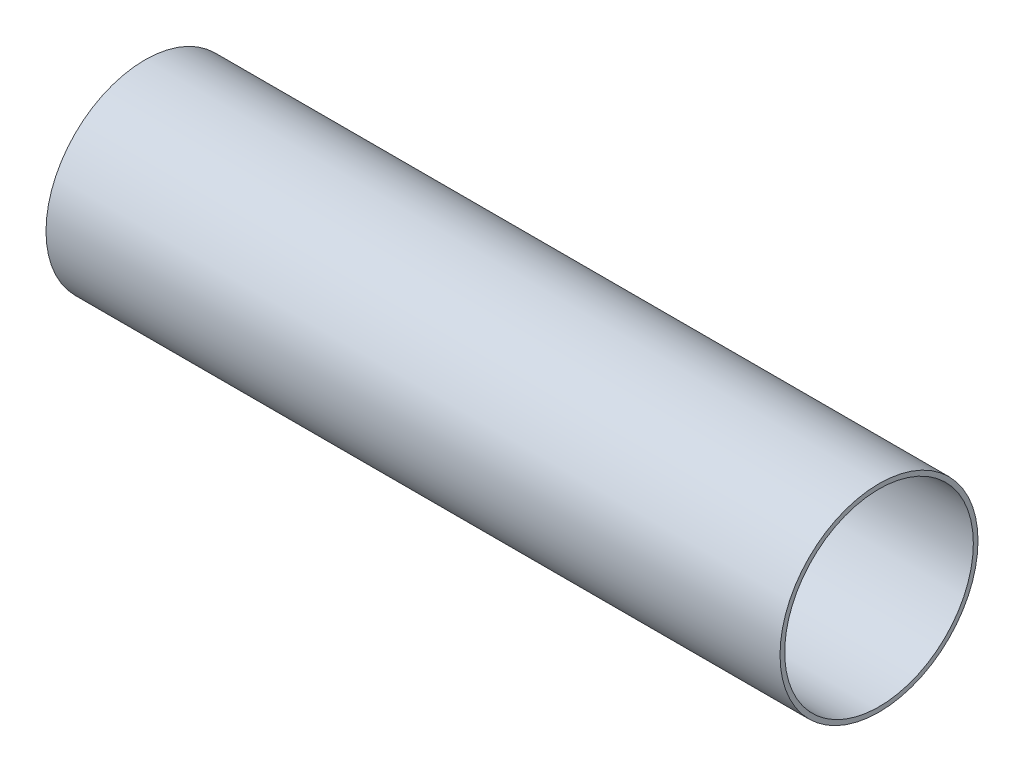
ISO-10303-21;
HEADER;
FILE_DESCRIPTION(('STEP AP214'),'2;1');
FILE_NAME('part.step','',(''),(''),'','','');
FILE_SCHEMA(('AUTOMOTIVE_DESIGN { 1 0 10303 214 1 1 1 1 }'));
ENDSEC;
DATA;
#1=APPLICATION_CONTEXT('core data for automotive mechanical design processes');
#2=APPLICATION_PROTOCOL_DEFINITION('international standard','automotive_design',2000,#1);
#3=PRODUCT_CONTEXT('',#1,'mechanical');
#4=PRODUCT('Part','Part','',(#3));
#5=PRODUCT_RELATED_PRODUCT_CATEGORY('part','',(#4));
#6=PRODUCT_DEFINITION_FORMATION('','',#4);
#7=PRODUCT_DEFINITION_CONTEXT('part definition',#1,'design');
#8=PRODUCT_DEFINITION('design','',#6,#7);
#9=PRODUCT_DEFINITION_SHAPE('','',#8);
#10=(LENGTH_UNIT() NAMED_UNIT(*) SI_UNIT(.MILLI.,.METRE.));
#11=(NAMED_UNIT(*) PLANE_ANGLE_UNIT() SI_UNIT($,.RADIAN.));
#12=(NAMED_UNIT(*) SI_UNIT($,.STERADIAN.) SOLID_ANGLE_UNIT());
#13=UNCERTAINTY_MEASURE_WITH_UNIT(LENGTH_MEASURE(1.E-05),#10,'distance_accuracy_value','');
#14=(GEOMETRIC_REPRESENTATION_CONTEXT(3) GLOBAL_UNCERTAINTY_ASSIGNED_CONTEXT((#13)) GLOBAL_UNIT_ASSIGNED_CONTEXT((#10,
#11,#12)) REPRESENTATION_CONTEXT('',''));
#15=CARTESIAN_POINT('',(0.,0.,0.));
#16=DIRECTION('',(0.,0.,1.));
#17=DIRECTION('',(1.,0.,0.));
#18=AXIS2_PLACEMENT_3D('',#15,#16,#17);
#19=CARTESIAN_POINT('',(124.5,0.,0.));
#20=DIRECTION('',(1.,0.,0.));
#21=DIRECTION('',(0.,0.,-1.));
#22=AXIS2_PLACEMENT_3D('',#19,#20,#21);
#23=PLANE('',#22);
#24=CARTESIAN_POINT('',(124.5,0.,0.));
#25=DIRECTION('',(1.,0.,0.));
#26=DIRECTION('',(0.,0.,-1.));
#27=AXIS2_PLACEMENT_3D('',#24,#25,#26);
#28=CIRCLE('',#27,16.79);
#29=CARTESIAN_POINT('',(124.5,0.,-16.79));
#30=VERTEX_POINT('',#29);
#31=EDGE_CURVE('E10',#30,#30,#28,.T.);
#32=ORIENTED_EDGE('',*,*,#31,.T.);
#33=EDGE_LOOP('',(#32));
#34=FACE_BOUND('',#33,.T.);
#35=CARTESIAN_POINT('',(124.5,0.,0.));
#36=DIRECTION('',(1.,0.,0.));
#37=DIRECTION('',(0.,0.,-1.));
#38=AXIS2_PLACEMENT_3D('',#35,#36,#37);
#39=CIRCLE('',#38,16.);
#40=CARTESIAN_POINT('',(124.5,0.,-16.));
#41=VERTEX_POINT('',#40);
#42=EDGE_CURVE('E44',#41,#41,#39,.T.);
#43=ORIENTED_EDGE('',*,*,#42,.F.);
#44=EDGE_LOOP('',(#43));
#45=FACE_BOUND('',#44,.T.);
#46=ADVANCED_FACE('F33',(#34,#45),#23,.T.);
#47=CARTESIAN_POINT('',(0.,0.,0.));
#48=DIRECTION('',(1.,0.,0.));
#49=DIRECTION('',(0.,0.,-1.));
#50=AXIS2_PLACEMENT_3D('',#47,#48,#49);
#51=PLANE('',#50);
#52=CARTESIAN_POINT('',(0.,0.,0.));
#53=DIRECTION('',(1.,0.,0.));
#54=DIRECTION('',(0.,0.,-1.));
#55=AXIS2_PLACEMENT_3D('',#52,#53,#54);
#56=CIRCLE('',#55,16.79);
#57=CARTESIAN_POINT('',(0.,0.,-16.79));
#58=VERTEX_POINT('',#57);
#59=EDGE_CURVE('E37',#58,#58,#56,.T.);
#60=ORIENTED_EDGE('',*,*,#59,.F.);
#61=EDGE_LOOP('',(#60));
#62=FACE_BOUND('',#61,.T.);
#63=CARTESIAN_POINT('',(0.,0.,0.));
#64=DIRECTION('',(1.,0.,0.));
#65=DIRECTION('',(0.,0.,-1.));
#66=AXIS2_PLACEMENT_3D('',#63,#64,#65);
#67=CIRCLE('',#66,16.);
#68=CARTESIAN_POINT('',(0.,0.,-16.));
#69=VERTEX_POINT('',#68);
#70=EDGE_CURVE('E46',#69,#69,#67,.T.);
#71=ORIENTED_EDGE('',*,*,#70,.T.);
#72=EDGE_LOOP('',(#71));
#73=FACE_BOUND('',#72,.T.);
#74=ADVANCED_FACE('F56',(#62,#73),#51,.F.);
#75=CARTESIAN_POINT('',(124.5,0.,0.));
#76=DIRECTION('',(-1.,0.,0.));
#77=DIRECTION('',(0.,0.,1.));
#78=AXIS2_PLACEMENT_3D('',#75,#76,#77);
#79=CYLINDRICAL_SURFACE('',#78,16.79);
#80=ORIENTED_EDGE('',*,*,#31,.F.);
#81=EDGE_LOOP('',(#80));
#82=FACE_BOUND('',#81,.T.);
#83=ORIENTED_EDGE('',*,*,#59,.T.);
#84=EDGE_LOOP('',(#83));
#85=FACE_BOUND('',#84,.T.);
#86=ADVANCED_FACE('F35',(#82,#85),#79,.T.);
#87=CARTESIAN_POINT('',(124.5,0.,0.));
#88=DIRECTION('',(-1.,0.,0.));
#89=DIRECTION('',(0.,0.,1.));
#90=AXIS2_PLACEMENT_3D('',#87,#88,#89);
#91=CYLINDRICAL_SURFACE('',#90,16.);
#92=ORIENTED_EDGE('',*,*,#42,.T.);
#93=EDGE_LOOP('',(#92));
#94=FACE_BOUND('',#93,.T.);
#95=ORIENTED_EDGE('',*,*,#70,.F.);
#96=EDGE_LOOP('',(#95));
#97=FACE_BOUND('',#96,.T.);
#98=ADVANCED_FACE('F52',(#94,#97),#91,.F.);
#99=CLOSED_SHELL('',(#46,#74,#86,#98));
#100=MANIFOLD_SOLID_BREP('B2',#99);
#101=ADVANCED_BREP_SHAPE_REPRESENTATION('',(#18,#100),#14);
#102=SHAPE_DEFINITION_REPRESENTATION(#9,#101);
ENDSEC;
END-ISO-10303-21;
